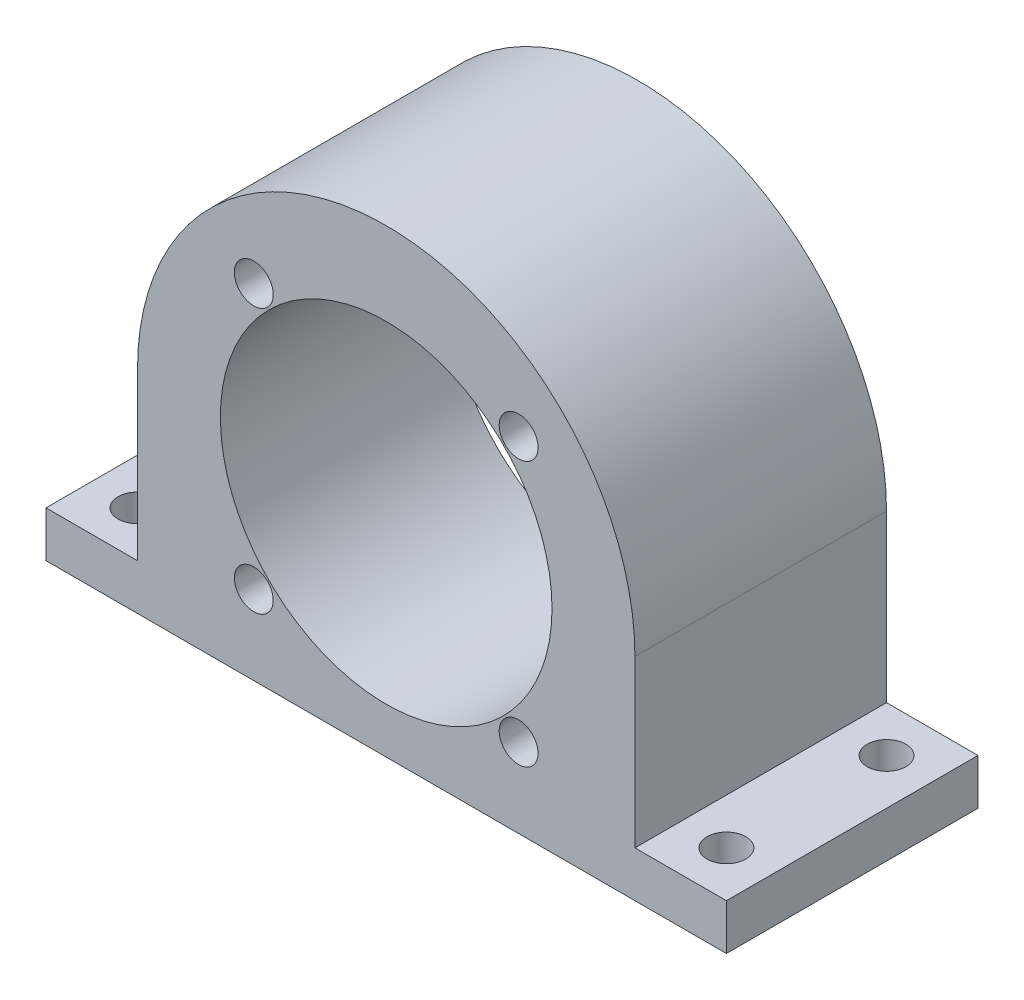
ISO-10303-21;
HEADER;
FILE_DESCRIPTION(('STEP AP214'),'2;1');
FILE_NAME('part.step','',(''),(''),'','','');
FILE_SCHEMA(('AUTOMOTIVE_DESIGN { 1 0 10303 214 1 1 1 1 }'));
ENDSEC;
DATA;
#1=APPLICATION_CONTEXT('core data for automotive mechanical design processes');
#2=APPLICATION_PROTOCOL_DEFINITION('international standard','automotive_design',2000,#1);
#3=PRODUCT_CONTEXT('',#1,'mechanical');
#4=PRODUCT('Part','Part','',(#3));
#5=PRODUCT_RELATED_PRODUCT_CATEGORY('part','',(#4));
#6=PRODUCT_DEFINITION_FORMATION('','',#4);
#7=PRODUCT_DEFINITION_CONTEXT('part definition',#1,'design');
#8=PRODUCT_DEFINITION('design','',#6,#7);
#9=PRODUCT_DEFINITION_SHAPE('','',#8);
#10=(LENGTH_UNIT() NAMED_UNIT(*) SI_UNIT(.MILLI.,.METRE.));
#11=(NAMED_UNIT(*) PLANE_ANGLE_UNIT() SI_UNIT($,.RADIAN.));
#12=(NAMED_UNIT(*) SI_UNIT($,.STERADIAN.) SOLID_ANGLE_UNIT());
#13=UNCERTAINTY_MEASURE_WITH_UNIT(LENGTH_MEASURE(1.E-05),#10,'distance_accuracy_value','');
#14=(GEOMETRIC_REPRESENTATION_CONTEXT(3) GLOBAL_UNCERTAINTY_ASSIGNED_CONTEXT((#13)) GLOBAL_UNIT_ASSIGNED_CONTEXT((#10,
#11,#12)) REPRESENTATION_CONTEXT('',''));
#15=CARTESIAN_POINT('',(0.,0.,0.));
#16=DIRECTION('',(0.,0.,1.));
#17=DIRECTION('',(1.,0.,0.));
#18=AXIS2_PLACEMENT_3D('',#15,#16,#17);
#19=CARTESIAN_POINT('',(21.75,18.5,11.));
#20=DIRECTION('',(-1.,0.,0.));
#21=DIRECTION('',(0.,0.,1.));
#22=AXIS2_PLACEMENT_3D('',#19,#20,#21);
#23=PLANE('',#22);
#24=DIRECTION('',(0.,0.,1.));
#25=VECTOR('',#24,1.);
#26=CARTESIAN_POINT('',(21.75,4.,11.));
#27=LINE('',#26,#25);
#28=CARTESIAN_POINT('',(21.75,4.,-11.));
#29=VERTEX_POINT('',#28);
#30=CARTESIAN_POINT('',(21.75,4.,11.));
#31=VERTEX_POINT('',#30);
#32=EDGE_CURVE('E345',#29,#31,#27,.T.);
#33=ORIENTED_EDGE('',*,*,#32,.F.);
#34=DIRECTION('',(0.,1.,0.));
#35=VECTOR('',#34,1.);
#36=CARTESIAN_POINT('',(21.75,18.5,-11.));
#37=LINE('',#36,#35);
#38=CARTESIAN_POINT('',(21.75,18.5,-11.));
#39=VERTEX_POINT('',#38);
#40=EDGE_CURVE('E412',#29,#39,#37,.T.);
#41=ORIENTED_EDGE('',*,*,#40,.T.);
#42=DIRECTION('',(0.,0.,-1.));
#43=VECTOR('',#42,1.);
#44=CARTESIAN_POINT('',(21.75,18.5,11.));
#45=LINE('',#44,#43);
#46=CARTESIAN_POINT('',(21.75,18.5,11.));
#47=VERTEX_POINT('',#46);
#48=EDGE_CURVE('E11',#47,#39,#45,.T.);
#49=ORIENTED_EDGE('',*,*,#48,.F.);
#50=DIRECTION('',(0.,1.,0.));
#51=VECTOR('',#50,1.);
#52=CARTESIAN_POINT('',(21.75,18.5,11.));
#53=LINE('',#52,#51);
#54=EDGE_CURVE('E403',#31,#47,#53,.T.);
#55=ORIENTED_EDGE('',*,*,#54,.F.);
#56=EDGE_LOOP('',(#33,#41,#49,#55));
#57=FACE_BOUND('',#56,.T.);
#58=ADVANCED_FACE('F35',(#57),#23,.F.);
#59=CARTESIAN_POINT('',(-21.75,18.5,11.));
#60=DIRECTION('',(1.,0.,0.));
#61=DIRECTION('',(0.,0.,-1.));
#62=AXIS2_PLACEMENT_3D('',#59,#60,#61);
#63=PLANE('',#62);
#64=DIRECTION('',(0.,0.,-1.));
#65=VECTOR('',#64,1.);
#66=CARTESIAN_POINT('',(-21.75,4.,-11.));
#67=LINE('',#66,#65);
#68=CARTESIAN_POINT('',(-21.75,4.,11.));
#69=VERTEX_POINT('',#68);
#70=CARTESIAN_POINT('',(-21.75,4.,-11.));
#71=VERTEX_POINT('',#70);
#72=EDGE_CURVE('E376',#69,#71,#67,.T.);
#73=ORIENTED_EDGE('',*,*,#72,.F.);
#74=DIRECTION('',(0.,-1.,0.));
#75=VECTOR('',#74,1.);
#76=CARTESIAN_POINT('',(-21.75,18.5,11.));
#77=LINE('',#76,#75);
#78=CARTESIAN_POINT('',(-21.75,18.5,11.));
#79=VERTEX_POINT('',#78);
#80=EDGE_CURVE('E397',#79,#69,#77,.T.);
#81=ORIENTED_EDGE('',*,*,#80,.F.);
#82=DIRECTION('',(0.,0.,-1.));
#83=VECTOR('',#82,1.);
#84=CARTESIAN_POINT('',(-21.75,18.5,11.));
#85=LINE('',#84,#83);
#86=CARTESIAN_POINT('',(-21.75,18.5,-11.));
#87=VERTEX_POINT('',#86);
#88=EDGE_CURVE('E43',#79,#87,#85,.T.);
#89=ORIENTED_EDGE('',*,*,#88,.T.);
#90=DIRECTION('',(0.,-1.,0.));
#91=VECTOR('',#90,1.);
#92=CARTESIAN_POINT('',(-21.75,18.5,-11.));
#93=LINE('',#92,#91);
#94=EDGE_CURVE('E392',#87,#71,#93,.T.);
#95=ORIENTED_EDGE('',*,*,#94,.T.);
#96=EDGE_LOOP('',(#73,#81,#89,#95));
#97=FACE_BOUND('',#96,.T.);
#98=ADVANCED_FACE('F37',(#97),#63,.F.);
#99=CARTESIAN_POINT('',(0.,18.5,11.));
#100=DIRECTION('',(0.,0.,1.));
#101=DIRECTION('',(1.,0.,0.));
#102=AXIS2_PLACEMENT_3D('',#99,#100,#101);
#103=PLANE('',#102);
#104=CARTESIAN_POINT('',(-11.5788735419298,30.0788735419296,11.));
#105=DIRECTION('',(0.,0.,1.));
#106=DIRECTION('',(0.,1.,0.));
#107=AXIS2_PLACEMENT_3D('',#104,#105,#106);
#108=CIRCLE('',#107,1.69999999999999);
#109=CARTESIAN_POINT('',(-11.5788735419299,31.7788735419296,11.));
#110=VERTEX_POINT('',#109);
#111=EDGE_CURVE('E261',#110,#110,#108,.F.);
#112=ORIENTED_EDGE('',*,*,#111,.T.);
#113=EDGE_LOOP('',(#112));
#114=FACE_BOUND('',#113,.T.);
#115=CARTESIAN_POINT('',(-11.5788735419297,6.92112645807019,11.));
#116=DIRECTION('',(0.,0.,1.));
#117=DIRECTION('',(-1.,0.,0.));
#118=AXIS2_PLACEMENT_3D('',#115,#116,#117);
#119=CIRCLE('',#118,1.69999999999999);
#120=CARTESIAN_POINT('',(-13.2788735419297,6.92112645807019,11.));
#121=VERTEX_POINT('',#120);
#122=EDGE_CURVE('E230',#121,#121,#119,.F.);
#123=ORIENTED_EDGE('',*,*,#122,.T.);
#124=EDGE_LOOP('',(#123));
#125=FACE_BOUND('',#124,.T.);
#126=CARTESIAN_POINT('',(11.5788735419299,6.92112645807044,11.));
#127=DIRECTION('',(0.,0.,1.));
#128=DIRECTION('',(0.,-1.,0.));
#129=AXIS2_PLACEMENT_3D('',#126,#127,#128);
#130=CIRCLE('',#129,1.69999999999999);
#131=CARTESIAN_POINT('',(11.5788735419299,5.22112645807044,11.));
#132=VERTEX_POINT('',#131);
#133=EDGE_CURVE('E262',#132,#132,#130,.F.);
#134=ORIENTED_EDGE('',*,*,#133,.T.);
#135=EDGE_LOOP('',(#134));
#136=FACE_BOUND('',#135,.T.);
#137=CARTESIAN_POINT('',(0.,18.5,11.));
#138=DIRECTION('',(0.,0.,1.));
#139=DIRECTION('',(1.,0.,0.));
#140=AXIS2_PLACEMENT_3D('',#137,#138,#139);
#141=CIRCLE('',#140,14.5);
#142=CARTESIAN_POINT('',(14.5,18.5,11.));
#143=VERTEX_POINT('',#142);
#144=EDGE_CURVE('E389',#143,#143,#141,.T.);
#145=ORIENTED_EDGE('',*,*,#144,.F.);
#146=EDGE_LOOP('',(#145));
#147=FACE_BOUND('',#146,.T.);
#148=ORIENTED_EDGE('',*,*,#80,.T.);
#149=DIRECTION('',(1.,0.,0.));
#150=VECTOR('',#149,1.);
#151=CARTESIAN_POINT('',(-29.75,4.,11.));
#152=LINE('',#151,#150);
#153=CARTESIAN_POINT('',(-29.75,4.,11.));
#154=VERTEX_POINT('',#153);
#155=EDGE_CURVE('E367',#154,#69,#152,.T.);
#156=ORIENTED_EDGE('',*,*,#155,.F.);
#157=DIRECTION('',(0.,-1.,0.));
#158=VECTOR('',#157,1.);
#159=CARTESIAN_POINT('',(-29.75,0.,11.));
#160=LINE('',#159,#158);
#161=CARTESIAN_POINT('',(-29.75,0.,11.));
#162=VERTEX_POINT('',#161);
#163=EDGE_CURVE('E364',#154,#162,#160,.T.);
#164=ORIENTED_EDGE('',*,*,#163,.T.);
#165=DIRECTION('',(1.,0.,0.));
#166=VECTOR('',#165,1.);
#167=CARTESIAN_POINT('',(-21.75,0.,11.));
#168=LINE('',#167,#166);
#169=CARTESIAN_POINT('',(29.75,0.,11.));
#170=VERTEX_POINT('',#169);
#171=EDGE_CURVE('E400',#162,#170,#168,.T.);
#172=ORIENTED_EDGE('',*,*,#171,.T.);
#173=DIRECTION('',(0.,-1.,0.));
#174=VECTOR('',#173,1.);
#175=CARTESIAN_POINT('',(29.75,0.,11.));
#176=LINE('',#175,#174);
#177=CARTESIAN_POINT('',(29.75,4.,11.));
#178=VERTEX_POINT('',#177);
#179=EDGE_CURVE('E346',#178,#170,#176,.T.);
#180=ORIENTED_EDGE('',*,*,#179,.F.);
#181=DIRECTION('',(-1.,0.,0.));
#182=VECTOR('',#181,1.);
#183=CARTESIAN_POINT('',(29.75,4.,11.));
#184=LINE('',#183,#182);
#185=EDGE_CURVE('E353',#178,#31,#184,.T.);
#186=ORIENTED_EDGE('',*,*,#185,.T.);
#187=ORIENTED_EDGE('',*,*,#54,.T.);
#188=CARTESIAN_POINT('',(0.,18.5,11.));
#189=DIRECTION('',(0.,0.,1.));
#190=DIRECTION('',(1.,0.,0.));
#191=AXIS2_PLACEMENT_3D('',#188,#189,#190);
#192=CIRCLE('',#191,21.75);
#193=EDGE_CURVE('E405',#47,#79,#192,.T.);
#194=ORIENTED_EDGE('',*,*,#193,.T.);
#195=EDGE_LOOP('',(#148,#156,#164,#172,#180,#186,#187,#194));
#196=FACE_BOUND('',#195,.T.);
#197=CARTESIAN_POINT('',(11.5788735419297,30.0788735419298,11.));
#198=DIRECTION('',(0.,0.,1.));
#199=DIRECTION('',(1.,0.,0.));
#200=AXIS2_PLACEMENT_3D('',#197,#198,#199);
#201=CIRCLE('',#200,1.69999999999999);
#202=CARTESIAN_POINT('',(13.2788735419297,30.0788735419298,11.));
#203=VERTEX_POINT('',#202);
#204=EDGE_CURVE('E296',#203,#203,#201,.F.);
#205=ORIENTED_EDGE('',*,*,#204,.T.);
#206=EDGE_LOOP('',(#205));
#207=FACE_BOUND('',#206,.T.);
#208=ADVANCED_FACE('F434',(#114,#125,#136,#147,#196,#207),#103,.T.);
#209=CARTESIAN_POINT('',(-29.75,4.,-11.));
#210=DIRECTION('',(0.,-1.,0.));
#211=DIRECTION('',(0.,0.,-1.));
#212=AXIS2_PLACEMENT_3D('',#209,#210,#211);
#213=PLANE('',#212);
#214=ORIENTED_EDGE('',*,*,#72,.T.);
#215=DIRECTION('',(1.,0.,0.));
#216=VECTOR('',#215,1.);
#217=CARTESIAN_POINT('',(-29.75,4.,-11.));
#218=LINE('',#217,#216);
#219=CARTESIAN_POINT('',(-29.75,4.,-11.));
#220=VERTEX_POINT('',#219);
#221=EDGE_CURVE('E384',#220,#71,#218,.T.);
#222=ORIENTED_EDGE('',*,*,#221,.F.);
#223=DIRECTION('',(0.,0.,-1.));
#224=VECTOR('',#223,1.);
#225=CARTESIAN_POINT('',(-29.75,4.,-11.));
#226=LINE('',#225,#224);
#227=EDGE_CURVE('E382',#154,#220,#226,.T.);
#228=ORIENTED_EDGE('',*,*,#227,.F.);
#229=ORIENTED_EDGE('',*,*,#155,.T.);
#230=EDGE_LOOP('',(#214,#222,#228,#229));
#231=FACE_BOUND('',#230,.T.);
#232=CARTESIAN_POINT('',(-25.75,4.,-7.));
#233=DIRECTION('',(0.,1.,0.));
#234=DIRECTION('',(0.,0.,1.));
#235=AXIS2_PLACEMENT_3D('',#232,#233,#234);
#236=CIRCLE('',#235,1.69999999999999);
#237=CARTESIAN_POINT('',(-25.75,4.,-5.30000000000001));
#238=VERTEX_POINT('',#237);
#239=EDGE_CURVE('E370',#238,#238,#236,.T.);
#240=ORIENTED_EDGE('',*,*,#239,.F.);
#241=EDGE_LOOP('',(#240));
#242=FACE_BOUND('',#241,.T.);
#243=CARTESIAN_POINT('',(-25.75,4.,7.));
#244=DIRECTION('',(0.,1.,0.));
#245=DIRECTION('',(0.,0.,1.));
#246=AXIS2_PLACEMENT_3D('',#243,#244,#245);
#247=CIRCLE('',#246,1.69999999999999);
#248=CARTESIAN_POINT('',(-25.75,4.,8.69999999999999));
#249=VERTEX_POINT('',#248);
#250=EDGE_CURVE('E358',#249,#249,#247,.T.);
#251=ORIENTED_EDGE('',*,*,#250,.F.);
#252=EDGE_LOOP('',(#251));
#253=FACE_BOUND('',#252,.T.);
#254=ADVANCED_FACE('F429',(#231,#242,#253),#213,.F.);
#255=CARTESIAN_POINT('',(0.,18.5,-11.));
#256=DIRECTION('',(0.,0.,1.));
#257=DIRECTION('',(1.,0.,0.));
#258=AXIS2_PLACEMENT_3D('',#255,#256,#257);
#259=PLANE('',#258);
#260=ORIENTED_EDGE('',*,*,#94,.F.);
#261=CARTESIAN_POINT('',(0.,18.5,-11.));
#262=DIRECTION('',(0.,0.,1.));
#263=DIRECTION('',(1.,0.,0.));
#264=AXIS2_PLACEMENT_3D('',#261,#262,#263);
#265=CIRCLE('',#264,21.75);
#266=EDGE_CURVE('E401',#39,#87,#265,.T.);
#267=ORIENTED_EDGE('',*,*,#266,.F.);
#268=ORIENTED_EDGE('',*,*,#40,.F.);
#269=DIRECTION('',(-1.,0.,0.));
#270=VECTOR('',#269,1.);
#271=CARTESIAN_POINT('',(29.75,4.,-11.));
#272=LINE('',#271,#270);
#273=CARTESIAN_POINT('',(29.75,4.,-11.));
#274=VERTEX_POINT('',#273);
#275=EDGE_CURVE('E336',#274,#29,#272,.T.);
#276=ORIENTED_EDGE('',*,*,#275,.F.);
#277=DIRECTION('',(0.,-1.,0.));
#278=VECTOR('',#277,1.);
#279=CARTESIAN_POINT('',(29.75,0.,-11.));
#280=LINE('',#279,#278);
#281=CARTESIAN_POINT('',(29.75,0.,-11.));
#282=VERTEX_POINT('',#281);
#283=EDGE_CURVE('E333',#274,#282,#280,.T.);
#284=ORIENTED_EDGE('',*,*,#283,.T.);
#285=DIRECTION('',(1.,0.,0.));
#286=VECTOR('',#285,1.);
#287=CARTESIAN_POINT('',(-21.75,0.,-11.));
#288=LINE('',#287,#286);
#289=CARTESIAN_POINT('',(-29.75,0.,-11.));
#290=VERTEX_POINT('',#289);
#291=EDGE_CURVE('E409',#290,#282,#288,.T.);
#292=ORIENTED_EDGE('',*,*,#291,.F.);
#293=DIRECTION('',(0.,-1.,0.));
#294=VECTOR('',#293,1.);
#295=CARTESIAN_POINT('',(-29.75,0.,-11.));
#296=LINE('',#295,#294);
#297=EDGE_CURVE('E377',#220,#290,#296,.T.);
#298=ORIENTED_EDGE('',*,*,#297,.F.);
#299=ORIENTED_EDGE('',*,*,#221,.T.);
#300=EDGE_LOOP('',(#260,#267,#268,#276,#284,#292,#298,#299));
#301=FACE_BOUND('',#300,.T.);
#302=CARTESIAN_POINT('',(-11.5788735419298,30.0788735419296,-11.));
#303=DIRECTION('',(0.,0.,-1.));
#304=DIRECTION('',(0.,1.,0.));
#305=AXIS2_PLACEMENT_3D('',#302,#303,#304);
#306=CIRCLE('',#305,3.87499999999999);
#307=CARTESIAN_POINT('',(-14.3189123190277,27.3388347648318,-11.));
#308=VERTEX_POINT('',#307);
#309=CARTESIAN_POINT('',(-8.838834764832,32.8189123190275,-11.));
#310=VERTEX_POINT('',#309);
#311=EDGE_CURVE('E214',#308,#310,#306,.T.);
#312=ORIENTED_EDGE('',*,*,#311,.F.);
#313=DIRECTION('',(-0.707106781186552,0.707106781186543,0.));
#314=VECTOR('',#313,1.);
#315=CARTESIAN_POINT('',(-14.3189123190277,27.3388347648318,-11.));
#316=LINE('',#315,#314);
#317=CARTESIAN_POINT('',(-12.6201798439046,25.6401022897087,-11.));
#318=VERTEX_POINT('',#317);
#319=EDGE_CURVE('E224',#318,#308,#316,.T.);
#320=ORIENTED_EDGE('',*,*,#319,.F.);
#321=CARTESIAN_POINT('',(0.,18.5,-11.));
#322=DIRECTION('',(0.,0.,1.));
#323=DIRECTION('',(1.,0.,0.));
#324=AXIS2_PLACEMENT_3D('',#321,#322,#323);
#325=CIRCLE('',#324,14.5);
#326=CARTESIAN_POINT('',(-12.6201798439045,11.3598977102911,-11.));
#327=VERTEX_POINT('',#326);
#328=EDGE_CURVE('E396',#318,#327,#325,.T.);
#329=ORIENTED_EDGE('',*,*,#328,.T.);
#330=DIRECTION('',(0.707106781186543,0.707106781186552,0.));
#331=VECTOR('',#330,1.);
#332=CARTESIAN_POINT('',(-14.3189123190276,9.66116523516805,-11.));
#333=LINE('',#332,#331);
#334=CARTESIAN_POINT('',(-14.3189123190276,9.66116523516805,-11.));
#335=VERTEX_POINT('',#334);
#336=EDGE_CURVE('E246',#335,#327,#333,.T.);
#337=ORIENTED_EDGE('',*,*,#336,.F.);
#338=CARTESIAN_POINT('',(-11.5788735419297,6.92112645807019,-11.));
#339=DIRECTION('',(0.,0.,-1.));
#340=DIRECTION('',(-1.,0.,0.));
#341=AXIS2_PLACEMENT_3D('',#338,#339,#340);
#342=CIRCLE('',#341,3.87499999999999);
#343=CARTESIAN_POINT('',(-8.8388347648318,4.18108768097234,-11.));
#344=VERTEX_POINT('',#343);
#345=EDGE_CURVE('E251',#344,#335,#342,.T.);
#346=ORIENTED_EDGE('',*,*,#345,.F.);
#347=DIRECTION('',(-0.707106781186546,-0.70710678118655,0.));
#348=VECTOR('',#347,1.);
#349=CARTESIAN_POINT('',(-8.8388347648318,4.18108768097234,-11.));
#350=LINE('',#349,#348);
#351=CARTESIAN_POINT('',(-7.14010228970875,5.8798201560954,-11.));
#352=VERTEX_POINT('',#351);
#353=EDGE_CURVE('E256',#352,#344,#350,.T.);
#354=ORIENTED_EDGE('',*,*,#353,.F.);
#355=CARTESIAN_POINT('',(7.14010228970902,5.87982015609555,-11.));
#356=VERTEX_POINT('',#355);
#357=EDGE_CURVE('E609',#352,#356,#325,.T.);
#358=ORIENTED_EDGE('',*,*,#357,.T.);
#359=DIRECTION('',(-0.707106781186559,0.707106781186536,0.));
#360=VECTOR('',#359,1.);
#361=CARTESIAN_POINT('',(8.8388347648321,4.18108768097252,-11.));
#362=LINE('',#361,#360);
#363=CARTESIAN_POINT('',(8.8388347648321,4.18108768097252,-11.));
#364=VERTEX_POINT('',#363);
#365=EDGE_CURVE('E278',#364,#356,#362,.T.);
#366=ORIENTED_EDGE('',*,*,#365,.F.);
#367=CARTESIAN_POINT('',(11.5788735419299,6.92112645807044,-11.));
#368=DIRECTION('',(0.,0.,-1.));
#369=DIRECTION('',(0.,-1.,0.));
#370=AXIS2_PLACEMENT_3D('',#367,#368,#369);
#371=CIRCLE('',#370,3.87499999999999);
#372=CARTESIAN_POINT('',(14.3189123190277,9.66116523516835,-11.));
#373=VERTEX_POINT('',#372);
#374=EDGE_CURVE('E285',#373,#364,#371,.T.);
#375=ORIENTED_EDGE('',*,*,#374,.F.);
#376=DIRECTION('',(0.707106781186557,-0.707106781186538,0.));
#377=VECTOR('',#376,1.);
#378=CARTESIAN_POINT('',(14.3189123190277,9.66116523516835,-11.));
#379=LINE('',#378,#377);
#380=CARTESIAN_POINT('',(12.6201798439047,11.3598977102914,-11.));
#381=VERTEX_POINT('',#380);
#382=EDGE_CURVE('E290',#381,#373,#379,.T.);
#383=ORIENTED_EDGE('',*,*,#382,.F.);
#384=CARTESIAN_POINT('',(12.6201798439045,25.6401022897089,-11.));
#385=VERTEX_POINT('',#384);
#386=EDGE_CURVE('E388',#381,#385,#325,.T.);
#387=ORIENTED_EDGE('',*,*,#386,.T.);
#388=DIRECTION('',(-0.707106781186543,-0.707106781186552,0.));
#389=VECTOR('',#388,1.);
#390=CARTESIAN_POINT('',(14.3189123190276,27.338834764832,-11.));
#391=LINE('',#390,#389);
#392=CARTESIAN_POINT('',(14.3189123190276,27.338834764832,-11.));
#393=VERTEX_POINT('',#392);
#394=EDGE_CURVE('E314',#393,#385,#391,.T.);
#395=ORIENTED_EDGE('',*,*,#394,.F.);
#396=CARTESIAN_POINT('',(11.5788735419297,30.0788735419298,-11.));
#397=DIRECTION('',(0.,0.,-1.));
#398=DIRECTION('',(1.,0.,0.));
#399=AXIS2_PLACEMENT_3D('',#396,#397,#398);
#400=CIRCLE('',#399,3.87499999999999);
#401=CARTESIAN_POINT('',(8.8388347648318,32.8189123190277,-11.));
#402=VERTEX_POINT('',#401);
#403=EDGE_CURVE('E299',#402,#393,#400,.T.);
#404=ORIENTED_EDGE('',*,*,#403,.F.);
#405=DIRECTION('',(0.707106781186546,0.70710678118655,0.));
#406=VECTOR('',#405,1.);
#407=CARTESIAN_POINT('',(8.8388347648318,32.8189123190277,-11.));
#408=LINE('',#407,#406);
#409=CARTESIAN_POINT('',(7.14010228970875,31.1201798439046,-11.));
#410=VERTEX_POINT('',#409);
#411=EDGE_CURVE('E304',#410,#402,#408,.T.);
#412=ORIENTED_EDGE('',*,*,#411,.F.);
#413=CARTESIAN_POINT('',(-7.14010228970893,31.1201798439045,-11.));
#414=VERTEX_POINT('',#413);
#415=EDGE_CURVE('E393',#410,#414,#325,.T.);
#416=ORIENTED_EDGE('',*,*,#415,.T.);
#417=DIRECTION('',(0.707106781186554,-0.707106781186541,0.));
#418=VECTOR('',#417,1.);
#419=CARTESIAN_POINT('',(-8.838834764832,32.8189123190275,-11.));
#420=LINE('',#419,#418);
#421=EDGE_CURVE('E219',#310,#414,#420,.T.);
#422=ORIENTED_EDGE('',*,*,#421,.F.);
#423=EDGE_LOOP('',(#312,#320,#329,#337,#346,#354,#358,#366,#375,#383,#387,#395,#404,#412,#416,#422));
#424=FACE_BOUND('',#423,.T.);
#425=ADVANCED_FACE('F423',(#301,#424),#259,.F.);
#426=CARTESIAN_POINT('',(-21.75,0.,11.));
#427=DIRECTION('',(0.,1.,0.));
#428=DIRECTION('',(0.,0.,1.));
#429=AXIS2_PLACEMENT_3D('',#426,#427,#428);
#430=PLANE('',#429);
#431=CARTESIAN_POINT('',(-25.75,0.,7.));
#432=DIRECTION('',(0.,1.,0.));
#433=DIRECTION('',(0.,0.,1.));
#434=AXIS2_PLACEMENT_3D('',#431,#432,#433);
#435=CIRCLE('',#434,1.69999999999999);
#436=CARTESIAN_POINT('',(-25.75,0.,8.69999999999999));
#437=VERTEX_POINT('',#436);
#438=EDGE_CURVE('E361',#437,#437,#435,.T.);
#439=ORIENTED_EDGE('',*,*,#438,.T.);
#440=EDGE_LOOP('',(#439));
#441=FACE_BOUND('',#440,.T.);
#442=CARTESIAN_POINT('',(25.75,0.,7.));
#443=DIRECTION('',(0.,1.,0.));
#444=DIRECTION('',(0.,0.,1.));
#445=AXIS2_PLACEMENT_3D('',#442,#443,#444);
#446=CIRCLE('',#445,1.69999999999999);
#447=CARTESIAN_POINT('',(25.75,0.,8.69999999999999));
#448=VERTEX_POINT('',#447);
#449=EDGE_CURVE('E342',#448,#448,#446,.T.);
#450=ORIENTED_EDGE('',*,*,#449,.T.);
#451=EDGE_LOOP('',(#450));
#452=FACE_BOUND('',#451,.T.);
#453=ORIENTED_EDGE('',*,*,#171,.F.);
#454=DIRECTION('',(0.,0.,1.));
#455=VECTOR('',#454,1.);
#456=CARTESIAN_POINT('',(-29.75,0.,-11.));
#457=LINE('',#456,#455);
#458=EDGE_CURVE('E380',#290,#162,#457,.T.);
#459=ORIENTED_EDGE('',*,*,#458,.F.);
#460=ORIENTED_EDGE('',*,*,#291,.T.);
#461=DIRECTION('',(0.,0.,-1.));
#462=VECTOR('',#461,1.);
#463=CARTESIAN_POINT('',(29.75,0.,11.));
#464=LINE('',#463,#462);
#465=EDGE_CURVE('E349',#170,#282,#464,.T.);
#466=ORIENTED_EDGE('',*,*,#465,.F.);
#467=EDGE_LOOP('',(#453,#459,#460,#466));
#468=FACE_BOUND('',#467,.T.);
#469=CARTESIAN_POINT('',(-25.75,0.,-7.));
#470=DIRECTION('',(0.,1.,0.));
#471=DIRECTION('',(0.,0.,1.));
#472=AXIS2_PLACEMENT_3D('',#469,#470,#471);
#473=CIRCLE('',#472,1.69999999999999);
#474=CARTESIAN_POINT('',(-25.75,0.,-5.30000000000001));
#475=VERTEX_POINT('',#474);
#476=EDGE_CURVE('E373',#475,#475,#473,.T.);
#477=ORIENTED_EDGE('',*,*,#476,.T.);
#478=EDGE_LOOP('',(#477));
#479=FACE_BOUND('',#478,.T.);
#480=CARTESIAN_POINT('',(25.75,0.,-7.));
#481=DIRECTION('',(0.,1.,0.));
#482=DIRECTION('',(0.,0.,1.));
#483=AXIS2_PLACEMENT_3D('',#480,#481,#482);
#484=CIRCLE('',#483,1.69999999999999);
#485=CARTESIAN_POINT('',(25.75,0.,-5.30000000000001));
#486=VERTEX_POINT('',#485);
#487=EDGE_CURVE('E330',#486,#486,#484,.T.);
#488=ORIENTED_EDGE('',*,*,#487,.T.);
#489=EDGE_LOOP('',(#488));
#490=FACE_BOUND('',#489,.T.);
#491=ADVANCED_FACE('F452',(#441,#452,#468,#479,#490),#430,.F.);
#492=CARTESIAN_POINT('',(0.,18.5,11.));
#493=DIRECTION('',(0.,0.,-1.));
#494=DIRECTION('',(-1.,0.,0.));
#495=AXIS2_PLACEMENT_3D('',#492,#493,#494);
#496=CYLINDRICAL_SURFACE('',#495,21.75);
#497=ORIENTED_EDGE('',*,*,#266,.T.);
#498=ORIENTED_EDGE('',*,*,#88,.F.);
#499=ORIENTED_EDGE('',*,*,#193,.F.);
#500=ORIENTED_EDGE('',*,*,#48,.T.);
#501=EDGE_LOOP('',(#497,#498,#499,#500));
#502=FACE_BOUND('',#501,.T.);
#503=ADVANCED_FACE('F437',(#502),#496,.T.);
#504=CARTESIAN_POINT('',(0.,18.5,11.));
#505=DIRECTION('',(0.,0.,-1.));
#506=DIRECTION('',(-1.,0.,0.));
#507=AXIS2_PLACEMENT_3D('',#504,#505,#506);
#508=CYLINDRICAL_SURFACE('',#507,14.5);
#509=DIRECTION('',(0.,0.,-1.));
#510=VECTOR('',#509,1.);
#511=CARTESIAN_POINT('',(-12.6201798439046,25.6401022897087,-9.));
#512=LINE('',#511,#510);
#513=CARTESIAN_POINT('',(-12.6201798439046,25.6401022897087,-9.));
#514=VERTEX_POINT('',#513);
#515=EDGE_CURVE('E227',#514,#318,#512,.T.);
#516=ORIENTED_EDGE('',*,*,#515,.F.);
#517=CARTESIAN_POINT('',(0.,18.5,-9.));
#518=DIRECTION('',(0.,0.,1.));
#519=DIRECTION('',(0.,-1.,0.));
#520=AXIS2_PLACEMENT_3D('',#517,#518,#519);
#521=CIRCLE('',#520,14.5);
#522=CARTESIAN_POINT('',(-7.14010228970893,31.1201798439045,-9.));
#523=VERTEX_POINT('',#522);
#524=EDGE_CURVE('E587',#523,#514,#521,.T.);
#525=ORIENTED_EDGE('',*,*,#524,.F.);
#526=DIRECTION('',(0.,0.,-1.));
#527=VECTOR('',#526,1.);
#528=CARTESIAN_POINT('',(-7.14010228970893,31.1201798439045,-9.));
#529=LINE('',#528,#527);
#530=EDGE_CURVE('E50',#523,#414,#529,.T.);
#531=ORIENTED_EDGE('',*,*,#530,.T.);
#532=ORIENTED_EDGE('',*,*,#415,.F.);
#533=DIRECTION('',(0.,0.,-1.));
#534=VECTOR('',#533,1.);
#535=CARTESIAN_POINT('',(7.14010228970875,31.1201798439046,-9.));
#536=LINE('',#535,#534);
#537=CARTESIAN_POINT('',(7.14010228970875,31.1201798439046,-9.));
#538=VERTEX_POINT('',#537);
#539=EDGE_CURVE('E322',#538,#410,#536,.T.);
#540=ORIENTED_EDGE('',*,*,#539,.F.);
#541=CARTESIAN_POINT('',(0.,18.5,-9.));
#542=DIRECTION('',(0.,0.,1.));
#543=DIRECTION('',(-1.,0.,0.));
#544=AXIS2_PLACEMENT_3D('',#541,#542,#543);
#545=CIRCLE('',#544,14.5);
#546=CARTESIAN_POINT('',(12.6201798439045,25.6401022897089,-9.));
#547=VERTEX_POINT('',#546);
#548=EDGE_CURVE('E306',#547,#538,#545,.T.);
#549=ORIENTED_EDGE('',*,*,#548,.F.);
#550=DIRECTION('',(0.,0.,-1.));
#551=VECTOR('',#550,1.);
#552=CARTESIAN_POINT('',(12.6201798439045,25.6401022897089,-9.));
#553=LINE('',#552,#551);
#554=EDGE_CURVE('E324',#547,#385,#553,.T.);
#555=ORIENTED_EDGE('',*,*,#554,.T.);
#556=ORIENTED_EDGE('',*,*,#386,.F.);
#557=DIRECTION('',(0.,0.,-1.));
#558=VECTOR('',#557,1.);
#559=CARTESIAN_POINT('',(12.6201798439047,11.3598977102914,-9.));
#560=LINE('',#559,#558);
#561=CARTESIAN_POINT('',(12.6201798439047,11.3598977102914,-9.));
#562=VERTEX_POINT('',#561);
#563=EDGE_CURVE('E234',#562,#381,#560,.T.);
#564=ORIENTED_EDGE('',*,*,#563,.F.);
#565=CARTESIAN_POINT('',(0.,18.5,-9.));
#566=DIRECTION('',(0.,0.,1.));
#567=DIRECTION('',(0.,1.,0.));
#568=AXIS2_PLACEMENT_3D('',#565,#566,#567);
#569=CIRCLE('',#568,14.5);
#570=CARTESIAN_POINT('',(7.14010228970902,5.87982015609555,-9.));
#571=VERTEX_POINT('',#570);
#572=EDGE_CURVE('E265',#571,#562,#569,.T.);
#573=ORIENTED_EDGE('',*,*,#572,.F.);
#574=DIRECTION('',(0.,0.,-1.));
#575=VECTOR('',#574,1.);
#576=CARTESIAN_POINT('',(7.14010228970902,5.87982015609555,-9.));
#577=LINE('',#576,#575);
#578=EDGE_CURVE('E280',#571,#356,#577,.T.);
#579=ORIENTED_EDGE('',*,*,#578,.T.);
#580=ORIENTED_EDGE('',*,*,#357,.F.);
#581=DIRECTION('',(0.,0.,-1.));
#582=VECTOR('',#581,1.);
#583=CARTESIAN_POINT('',(-7.14010228970875,5.8798201560954,-9.));
#584=LINE('',#583,#582);
#585=CARTESIAN_POINT('',(-7.14010228970875,5.8798201560954,-9.));
#586=VERTEX_POINT('',#585);
#587=EDGE_CURVE('E259',#586,#352,#584,.T.);
#588=ORIENTED_EDGE('',*,*,#587,.F.);
#589=CARTESIAN_POINT('',(0.,18.5,-9.));
#590=DIRECTION('',(0.,0.,1.));
#591=DIRECTION('',(1.,0.,0.));
#592=AXIS2_PLACEMENT_3D('',#589,#590,#591);
#593=CIRCLE('',#592,14.5);
#594=CARTESIAN_POINT('',(-12.6201798439045,11.3598977102911,-9.));
#595=VERTEX_POINT('',#594);
#596=EDGE_CURVE('E233',#595,#586,#593,.T.);
#597=ORIENTED_EDGE('',*,*,#596,.F.);
#598=DIRECTION('',(0.,0.,-1.));
#599=VECTOR('',#598,1.);
#600=CARTESIAN_POINT('',(-12.6201798439045,11.3598977102911,-9.));
#601=LINE('',#600,#599);
#602=EDGE_CURVE('E58',#595,#327,#601,.T.);
#603=ORIENTED_EDGE('',*,*,#602,.T.);
#604=ORIENTED_EDGE('',*,*,#328,.F.);
#605=EDGE_LOOP('',(#516,#525,#531,#532,#540,#549,#555,#556,#564,#573,#579,#580,#588,#597,#603,#604));
#606=FACE_BOUND('',#605,.T.);
#607=ORIENTED_EDGE('',*,*,#144,.T.);
#608=EDGE_LOOP('',(#607));
#609=FACE_BOUND('',#608,.T.);
#610=ADVANCED_FACE('F458',(#606,#609),#508,.F.);
#611=CARTESIAN_POINT('',(-29.75,0.,0.));
#612=DIRECTION('',(1.,0.,0.));
#613=DIRECTION('',(0.,0.,-1.));
#614=AXIS2_PLACEMENT_3D('',#611,#612,#613);
#615=PLANE('',#614);
#616=ORIENTED_EDGE('',*,*,#297,.T.);
#617=ORIENTED_EDGE('',*,*,#458,.T.);
#618=ORIENTED_EDGE('',*,*,#163,.F.);
#619=ORIENTED_EDGE('',*,*,#227,.T.);
#620=EDGE_LOOP('',(#616,#617,#618,#619));
#621=FACE_BOUND('',#620,.T.);
#622=ADVANCED_FACE('F455',(#621),#615,.F.);
#623=CARTESIAN_POINT('',(-25.75,4.,-7.));
#624=DIRECTION('',(0.,1.,0.));
#625=DIRECTION('',(0.,0.,1.));
#626=AXIS2_PLACEMENT_3D('',#623,#624,#625);
#627=CYLINDRICAL_SURFACE('',#626,1.69999999999999);
#628=ORIENTED_EDGE('',*,*,#476,.F.);
#629=EDGE_LOOP('',(#628));
#630=FACE_BOUND('',#629,.T.);
#631=ORIENTED_EDGE('',*,*,#239,.T.);
#632=EDGE_LOOP('',(#631));
#633=FACE_BOUND('',#632,.T.);
#634=ADVANCED_FACE('F457',(#630,#633),#627,.F.);
#635=CARTESIAN_POINT('',(-25.75,4.,7.));
#636=DIRECTION('',(0.,1.,0.));
#637=DIRECTION('',(0.,0.,1.));
#638=AXIS2_PLACEMENT_3D('',#635,#636,#637);
#639=CYLINDRICAL_SURFACE('',#638,1.69999999999999);
#640=ORIENTED_EDGE('',*,*,#438,.F.);
#641=EDGE_LOOP('',(#640));
#642=FACE_BOUND('',#641,.T.);
#643=ORIENTED_EDGE('',*,*,#250,.T.);
#644=EDGE_LOOP('',(#643));
#645=FACE_BOUND('',#644,.T.);
#646=ADVANCED_FACE('F464',(#642,#645),#639,.F.);
#647=CARTESIAN_POINT('',(29.75,4.,11.));
#648=DIRECTION('',(0.,-1.,0.));
#649=DIRECTION('',(0.,0.,-1.));
#650=AXIS2_PLACEMENT_3D('',#647,#648,#649);
#651=PLANE('',#650);
#652=CARTESIAN_POINT('',(25.75,4.,7.));
#653=DIRECTION('',(0.,1.,0.));
#654=DIRECTION('',(0.,0.,1.));
#655=AXIS2_PLACEMENT_3D('',#652,#653,#654);
#656=CIRCLE('',#655,1.69999999999999);
#657=CARTESIAN_POINT('',(25.75,4.,8.69999999999999));
#658=VERTEX_POINT('',#657);
#659=EDGE_CURVE('E339',#658,#658,#656,.T.);
#660=ORIENTED_EDGE('',*,*,#659,.F.);
#661=EDGE_LOOP('',(#660));
#662=FACE_BOUND('',#661,.T.);
#663=ORIENTED_EDGE('',*,*,#32,.T.);
#664=ORIENTED_EDGE('',*,*,#185,.F.);
#665=DIRECTION('',(0.,0.,1.));
#666=VECTOR('',#665,1.);
#667=CARTESIAN_POINT('',(29.75,4.,11.));
#668=LINE('',#667,#666);
#669=EDGE_CURVE('E351',#274,#178,#668,.T.);
#670=ORIENTED_EDGE('',*,*,#669,.F.);
#671=ORIENTED_EDGE('',*,*,#275,.T.);
#672=EDGE_LOOP('',(#663,#664,#670,#671));
#673=FACE_BOUND('',#672,.T.);
#674=CARTESIAN_POINT('',(25.75,4.,-7.));
#675=DIRECTION('',(0.,1.,0.));
#676=DIRECTION('',(0.,0.,1.));
#677=AXIS2_PLACEMENT_3D('',#674,#675,#676);
#678=CIRCLE('',#677,1.69999999999999);
#679=CARTESIAN_POINT('',(25.75,4.,-5.30000000000001));
#680=VERTEX_POINT('',#679);
#681=EDGE_CURVE('E321',#680,#680,#678,.T.);
#682=ORIENTED_EDGE('',*,*,#681,.F.);
#683=EDGE_LOOP('',(#682));
#684=FACE_BOUND('',#683,.T.);
#685=ADVANCED_FACE('F442',(#662,#673,#684),#651,.F.);
#686=CARTESIAN_POINT('',(29.75,0.,0.));
#687=DIRECTION('',(-1.,0.,0.));
#688=DIRECTION('',(0.,0.,1.));
#689=AXIS2_PLACEMENT_3D('',#686,#687,#688);
#690=PLANE('',#689);
#691=ORIENTED_EDGE('',*,*,#179,.T.);
#692=ORIENTED_EDGE('',*,*,#465,.T.);
#693=ORIENTED_EDGE('',*,*,#283,.F.);
#694=ORIENTED_EDGE('',*,*,#669,.T.);
#695=EDGE_LOOP('',(#691,#692,#693,#694));
#696=FACE_BOUND('',#695,.T.);
#697=ADVANCED_FACE('F447',(#696),#690,.F.);
#698=CARTESIAN_POINT('',(25.75,4.,7.));
#699=DIRECTION('',(0.,1.,0.));
#700=DIRECTION('',(0.,0.,1.));
#701=AXIS2_PLACEMENT_3D('',#698,#699,#700);
#702=CYLINDRICAL_SURFACE('',#701,1.69999999999999);
#703=ORIENTED_EDGE('',*,*,#449,.F.);
#704=EDGE_LOOP('',(#703));
#705=FACE_BOUND('',#704,.T.);
#706=ORIENTED_EDGE('',*,*,#659,.T.);
#707=EDGE_LOOP('',(#706));
#708=FACE_BOUND('',#707,.T.);
#709=ADVANCED_FACE('F487',(#705,#708),#702,.F.);
#710=CARTESIAN_POINT('',(25.75,4.,-7.));
#711=DIRECTION('',(0.,1.,0.));
#712=DIRECTION('',(0.,0.,1.));
#713=AXIS2_PLACEMENT_3D('',#710,#711,#712);
#714=CYLINDRICAL_SURFACE('',#713,1.69999999999999);
#715=ORIENTED_EDGE('',*,*,#487,.F.);
#716=EDGE_LOOP('',(#715));
#717=FACE_BOUND('',#716,.T.);
#718=ORIENTED_EDGE('',*,*,#681,.T.);
#719=EDGE_LOOP('',(#718));
#720=FACE_BOUND('',#719,.T.);
#721=ADVANCED_FACE('F490',(#717,#720),#714,.F.);
#722=CARTESIAN_POINT('',(11.5788735419297,30.0788735419298,-9.));
#723=DIRECTION('',(0.,0.,-1.));
#724=DIRECTION('',(-1.,0.,0.));
#725=AXIS2_PLACEMENT_3D('',#722,#723,#724);
#726=CYLINDRICAL_SURFACE('',#725,3.87499999999999);
#727=ORIENTED_EDGE('',*,*,#403,.T.);
#728=DIRECTION('',(0.,0.,-1.));
#729=VECTOR('',#728,1.);
#730=CARTESIAN_POINT('',(14.3189123190276,27.338834764832,-9.));
#731=LINE('',#730,#729);
#732=CARTESIAN_POINT('',(14.3189123190276,27.338834764832,-9.));
#733=VERTEX_POINT('',#732);
#734=EDGE_CURVE('E311',#733,#393,#731,.T.);
#735=ORIENTED_EDGE('',*,*,#734,.F.);
#736=CARTESIAN_POINT('',(11.5788735419297,30.0788735419298,-9.));
#737=DIRECTION('',(0.,0.,-1.));
#738=DIRECTION('',(1.,0.,0.));
#739=AXIS2_PLACEMENT_3D('',#736,#737,#738);
#740=CIRCLE('',#739,3.87499999999999);
#741=CARTESIAN_POINT('',(8.8388347648318,32.8189123190277,-9.));
#742=VERTEX_POINT('',#741);
#743=EDGE_CURVE('E300',#742,#733,#740,.T.);
#744=ORIENTED_EDGE('',*,*,#743,.F.);
#745=DIRECTION('',(0.,0.,-1.));
#746=VECTOR('',#745,1.);
#747=CARTESIAN_POINT('',(8.8388347648318,32.8189123190277,-9.));
#748=LINE('',#747,#746);
#749=EDGE_CURVE('E319',#742,#402,#748,.T.);
#750=ORIENTED_EDGE('',*,*,#749,.T.);
#751=EDGE_LOOP('',(#727,#735,#744,#750));
#752=FACE_BOUND('',#751,.T.);
#753=ADVANCED_FACE('F506',(#752),#726,.F.);
#754=CARTESIAN_POINT('',(8.8388347648318,32.8189123190277,-9.));
#755=DIRECTION('',(-0.70710678118655,0.707106781186546,0.));
#756=DIRECTION('',(-0.707106781186546,-0.70710678118655,0.));
#757=AXIS2_PLACEMENT_3D('',#754,#755,#756);
#758=PLANE('',#757);
#759=ORIENTED_EDGE('',*,*,#411,.T.);
#760=ORIENTED_EDGE('',*,*,#749,.F.);
#761=DIRECTION('',(0.707106781186546,0.70710678118655,0.));
#762=VECTOR('',#761,1.);
#763=CARTESIAN_POINT('',(8.8388347648318,32.8189123190277,-9.));
#764=LINE('',#763,#762);
#765=EDGE_CURVE('E308',#538,#742,#764,.T.);
#766=ORIENTED_EDGE('',*,*,#765,.F.);
#767=ORIENTED_EDGE('',*,*,#539,.T.);
#768=EDGE_LOOP('',(#759,#760,#766,#767));
#769=FACE_BOUND('',#768,.T.);
#770=ADVANCED_FACE('F510',(#769),#758,.F.);
#771=CARTESIAN_POINT('',(14.3189123190276,27.338834764832,-9.));
#772=DIRECTION('',(0.707106781186552,-0.707106781186543,0.));
#773=DIRECTION('',(0.707106781186543,0.707106781186552,0.));
#774=AXIS2_PLACEMENT_3D('',#771,#772,#773);
#775=PLANE('',#774);
#776=ORIENTED_EDGE('',*,*,#394,.T.);
#777=ORIENTED_EDGE('',*,*,#554,.F.);
#778=DIRECTION('',(-0.707106781186543,-0.707106781186552,0.));
#779=VECTOR('',#778,1.);
#780=CARTESIAN_POINT('',(14.3189123190276,27.338834764832,-9.));
#781=LINE('',#780,#779);
#782=EDGE_CURVE('E303',#733,#547,#781,.T.);
#783=ORIENTED_EDGE('',*,*,#782,.F.);
#784=ORIENTED_EDGE('',*,*,#734,.T.);
#785=EDGE_LOOP('',(#776,#777,#783,#784));
#786=FACE_BOUND('',#785,.T.);
#787=ADVANCED_FACE('F512',(#786),#775,.F.);
#788=CARTESIAN_POINT('',(11.5788735419297,30.0788735419298,-9.));
#789=DIRECTION('',(0.,0.,1.));
#790=DIRECTION('',(1.,0.,0.));
#791=AXIS2_PLACEMENT_3D('',#788,#789,#790);
#792=PLANE('',#791);
#793=CARTESIAN_POINT('',(11.5788735419297,30.0788735419298,-9.));
#794=DIRECTION('',(0.,0.,-1.));
#795=DIRECTION('',(-1.,0.,0.));
#796=AXIS2_PLACEMENT_3D('',#793,#794,#795);
#797=CIRCLE('',#796,1.69999999999999);
#798=CARTESIAN_POINT('',(9.87887354192969,30.0788735419298,-9.));
#799=VERTEX_POINT('',#798);
#800=EDGE_CURVE('E229',#799,#799,#797,.T.);
#801=ORIENTED_EDGE('',*,*,#800,.F.);
#802=EDGE_LOOP('',(#801));
#803=FACE_BOUND('',#802,.T.);
#804=ORIENTED_EDGE('',*,*,#743,.T.);
#805=ORIENTED_EDGE('',*,*,#782,.T.);
#806=ORIENTED_EDGE('',*,*,#548,.T.);
#807=ORIENTED_EDGE('',*,*,#765,.T.);
#808=EDGE_LOOP('',(#804,#805,#806,#807));
#809=FACE_BOUND('',#808,.T.);
#810=ADVANCED_FACE('F515',(#803,#809),#792,.F.);
#811=CARTESIAN_POINT('',(11.5788735419297,30.0788735419298,-9.));
#812=DIRECTION('',(0.,0.,-1.));
#813=DIRECTION('',(-1.,0.,0.));
#814=AXIS2_PLACEMENT_3D('',#811,#812,#813);
#815=CYLINDRICAL_SURFACE('',#814,1.69999999999999);
#816=ORIENTED_EDGE('',*,*,#204,.F.);
#817=EDGE_LOOP('',(#816));
#818=FACE_BOUND('',#817,.T.);
#819=ORIENTED_EDGE('',*,*,#800,.T.);
#820=EDGE_LOOP('',(#819));
#821=FACE_BOUND('',#820,.T.);
#822=ADVANCED_FACE('F522',(#818,#821),#815,.F.);
#823=CARTESIAN_POINT('',(14.3189123190277,9.66116523516835,-9.));
#824=DIRECTION('',(0.707106781186538,0.707106781186557,0.));
#825=DIRECTION('',(-0.707106781186557,0.707106781186538,0.));
#826=AXIS2_PLACEMENT_3D('',#823,#824,#825);
#827=PLANE('',#826);
#828=ORIENTED_EDGE('',*,*,#382,.T.);
#829=DIRECTION('',(0.,0.,-1.));
#830=VECTOR('',#829,1.);
#831=CARTESIAN_POINT('',(14.3189123190277,9.66116523516835,-9.));
#832=LINE('',#831,#830);
#833=CARTESIAN_POINT('',(14.3189123190277,9.66116523516835,-9.));
#834=VERTEX_POINT('',#833);
#835=EDGE_CURVE('E288',#834,#373,#832,.T.);
#836=ORIENTED_EDGE('',*,*,#835,.F.);
#837=DIRECTION('',(0.707106781186557,-0.707106781186538,0.));
#838=VECTOR('',#837,1.);
#839=CARTESIAN_POINT('',(14.3189123190277,9.66116523516835,-9.));
#840=LINE('',#839,#838);
#841=EDGE_CURVE('E275',#562,#834,#840,.T.);
#842=ORIENTED_EDGE('',*,*,#841,.F.);
#843=ORIENTED_EDGE('',*,*,#563,.T.);
#844=EDGE_LOOP('',(#828,#836,#842,#843));
#845=FACE_BOUND('',#844,.T.);
#846=ADVANCED_FACE('F526',(#845),#827,.F.);
#847=CARTESIAN_POINT('',(11.5788735419299,6.92112645807044,-9.));
#848=DIRECTION('',(0.,0.,-1.));
#849=DIRECTION('',(0.,1.,0.));
#850=AXIS2_PLACEMENT_3D('',#847,#848,#849);
#851=CYLINDRICAL_SURFACE('',#850,3.87499999999999);
#852=ORIENTED_EDGE('',*,*,#374,.T.);
#853=DIRECTION('',(0.,0.,-1.));
#854=VECTOR('',#853,1.);
#855=CARTESIAN_POINT('',(8.8388347648321,4.18108768097252,-9.));
#856=LINE('',#855,#854);
#857=CARTESIAN_POINT('',(8.8388347648321,4.18108768097252,-9.));
#858=VERTEX_POINT('',#857);
#859=EDGE_CURVE('E283',#858,#364,#856,.T.);
#860=ORIENTED_EDGE('',*,*,#859,.F.);
#861=CARTESIAN_POINT('',(11.5788735419299,6.92112645807044,-9.));
#862=DIRECTION('',(0.,0.,-1.));
#863=DIRECTION('',(0.,-1.,0.));
#864=AXIS2_PLACEMENT_3D('',#861,#862,#863);
#865=CIRCLE('',#864,3.87499999999999);
#866=EDGE_CURVE('E270',#834,#858,#865,.T.);
#867=ORIENTED_EDGE('',*,*,#866,.F.);
#868=ORIENTED_EDGE('',*,*,#835,.T.);
#869=EDGE_LOOP('',(#852,#860,#867,#868));
#870=FACE_BOUND('',#869,.T.);
#871=ADVANCED_FACE('F530',(#870),#851,.F.);
#872=CARTESIAN_POINT('',(8.8388347648321,4.18108768097252,-9.));
#873=DIRECTION('',(-0.707106781186536,-0.707106781186559,0.));
#874=DIRECTION('',(0.707106781186559,-0.707106781186536,0.));
#875=AXIS2_PLACEMENT_3D('',#872,#873,#874);
#876=PLANE('',#875);
#877=ORIENTED_EDGE('',*,*,#365,.T.);
#878=ORIENTED_EDGE('',*,*,#578,.F.);
#879=DIRECTION('',(-0.707106781186559,0.707106781186536,0.));
#880=VECTOR('',#879,1.);
#881=CARTESIAN_POINT('',(8.8388347648321,4.18108768097252,-9.));
#882=LINE('',#881,#880);
#883=EDGE_CURVE('E272',#858,#571,#882,.T.);
#884=ORIENTED_EDGE('',*,*,#883,.F.);
#885=ORIENTED_EDGE('',*,*,#859,.T.);
#886=EDGE_LOOP('',(#877,#878,#884,#885));
#887=FACE_BOUND('',#886,.T.);
#888=ADVANCED_FACE('F534',(#887),#876,.F.);
#889=CARTESIAN_POINT('',(11.5788735419299,6.92112645807044,-9.));
#890=DIRECTION('',(0.,0.,1.));
#891=DIRECTION('',(0.,-1.,0.));
#892=AXIS2_PLACEMENT_3D('',#889,#890,#891);
#893=PLANE('',#892);
#894=CARTESIAN_POINT('',(11.5788735419299,6.92112645807044,-9.));
#895=DIRECTION('',(0.,0.,-1.));
#896=DIRECTION('',(0.,1.,0.));
#897=AXIS2_PLACEMENT_3D('',#894,#895,#896);
#898=CIRCLE('',#897,1.69999999999999);
#899=CARTESIAN_POINT('',(11.5788735419299,8.62112645807043,-9.));
#900=VERTEX_POINT('',#899);
#901=EDGE_CURVE('E267',#900,#900,#898,.T.);
#902=ORIENTED_EDGE('',*,*,#901,.F.);
#903=EDGE_LOOP('',(#902));
#904=FACE_BOUND('',#903,.T.);
#905=ORIENTED_EDGE('',*,*,#866,.T.);
#906=ORIENTED_EDGE('',*,*,#883,.T.);
#907=ORIENTED_EDGE('',*,*,#572,.T.);
#908=ORIENTED_EDGE('',*,*,#841,.T.);
#909=EDGE_LOOP('',(#905,#906,#907,#908));
#910=FACE_BOUND('',#909,.T.);
#911=ADVANCED_FACE('F538',(#904,#910),#893,.F.);
#912=CARTESIAN_POINT('',(11.5788735419299,6.92112645807044,-9.));
#913=DIRECTION('',(0.,0.,-1.));
#914=DIRECTION('',(0.,1.,0.));
#915=AXIS2_PLACEMENT_3D('',#912,#913,#914);
#916=CYLINDRICAL_SURFACE('',#915,1.69999999999999);
#917=ORIENTED_EDGE('',*,*,#133,.F.);
#918=EDGE_LOOP('',(#917));
#919=FACE_BOUND('',#918,.T.);
#920=ORIENTED_EDGE('',*,*,#901,.T.);
#921=EDGE_LOOP('',(#920));
#922=FACE_BOUND('',#921,.T.);
#923=ADVANCED_FACE('F542',(#919,#922),#916,.F.);
#924=CARTESIAN_POINT('',(-8.8388347648318,4.18108768097234,-9.));
#925=DIRECTION('',(0.70710678118655,-0.707106781186546,0.));
#926=DIRECTION('',(0.707106781186546,0.70710678118655,0.));
#927=AXIS2_PLACEMENT_3D('',#924,#925,#926);
#928=PLANE('',#927);
#929=ORIENTED_EDGE('',*,*,#353,.T.);
#930=DIRECTION('',(0.,0.,-1.));
#931=VECTOR('',#930,1.);
#932=CARTESIAN_POINT('',(-8.8388347648318,4.18108768097234,-9.));
#933=LINE('',#932,#931);
#934=CARTESIAN_POINT('',(-8.8388347648318,4.18108768097234,-9.));
#935=VERTEX_POINT('',#934);
#936=EDGE_CURVE('E254',#935,#344,#933,.T.);
#937=ORIENTED_EDGE('',*,*,#936,.F.);
#938=DIRECTION('',(-0.707106781186546,-0.70710678118655,0.));
#939=VECTOR('',#938,1.);
#940=CARTESIAN_POINT('',(-8.8388347648318,4.18108768097234,-9.));
#941=LINE('',#940,#939);
#942=EDGE_CURVE('E243',#586,#935,#941,.T.);
#943=ORIENTED_EDGE('',*,*,#942,.F.);
#944=ORIENTED_EDGE('',*,*,#587,.T.);
#945=EDGE_LOOP('',(#929,#937,#943,#944));
#946=FACE_BOUND('',#945,.T.);
#947=ADVANCED_FACE('F546',(#946),#928,.F.);
#948=CARTESIAN_POINT('',(-11.5788735419297,6.92112645807019,-9.));
#949=DIRECTION('',(0.,0.,-1.));
#950=DIRECTION('',(1.,0.,0.));
#951=AXIS2_PLACEMENT_3D('',#948,#949,#950);
#952=CYLINDRICAL_SURFACE('',#951,3.87499999999999);
#953=ORIENTED_EDGE('',*,*,#345,.T.);
#954=DIRECTION('',(0.,0.,-1.));
#955=VECTOR('',#954,1.);
#956=CARTESIAN_POINT('',(-14.3189123190276,9.66116523516805,-9.));
#957=LINE('',#956,#955);
#958=CARTESIAN_POINT('',(-14.3189123190276,9.66116523516805,-9.));
#959=VERTEX_POINT('',#958);
#960=EDGE_CURVE('E249',#959,#335,#957,.T.);
#961=ORIENTED_EDGE('',*,*,#960,.F.);
#962=CARTESIAN_POINT('',(-11.5788735419297,6.92112645807019,-9.));
#963=DIRECTION('',(0.,0.,-1.));
#964=DIRECTION('',(-1.,0.,0.));
#965=AXIS2_PLACEMENT_3D('',#962,#963,#964);
#966=CIRCLE('',#965,3.87499999999999);
#967=EDGE_CURVE('E239',#935,#959,#966,.T.);
#968=ORIENTED_EDGE('',*,*,#967,.F.);
#969=ORIENTED_EDGE('',*,*,#936,.T.);
#970=EDGE_LOOP('',(#953,#961,#968,#969));
#971=FACE_BOUND('',#970,.T.);
#972=ADVANCED_FACE('F550',(#971),#952,.F.);
#973=CARTESIAN_POINT('',(-14.3189123190276,9.66116523516805,-9.));
#974=DIRECTION('',(-0.707106781186552,0.707106781186543,0.));
#975=DIRECTION('',(-0.707106781186543,-0.707106781186552,0.));
#976=AXIS2_PLACEMENT_3D('',#973,#974,#975);
#977=PLANE('',#976);
#978=ORIENTED_EDGE('',*,*,#336,.T.);
#979=ORIENTED_EDGE('',*,*,#602,.F.);
#980=DIRECTION('',(0.707106781186543,0.707106781186552,0.));
#981=VECTOR('',#980,1.);
#982=CARTESIAN_POINT('',(-14.3189123190276,9.66116523516805,-9.));
#983=LINE('',#982,#981);
#984=EDGE_CURVE('E241',#959,#595,#983,.T.);
#985=ORIENTED_EDGE('',*,*,#984,.F.);
#986=ORIENTED_EDGE('',*,*,#960,.T.);
#987=EDGE_LOOP('',(#978,#979,#985,#986));
#988=FACE_BOUND('',#987,.T.);
#989=ADVANCED_FACE('F554',(#988),#977,.F.);
#990=CARTESIAN_POINT('',(-11.5788735419297,6.92112645807019,-9.));
#991=DIRECTION('',(0.,0.,1.));
#992=DIRECTION('',(-1.,0.,0.));
#993=AXIS2_PLACEMENT_3D('',#990,#991,#992);
#994=PLANE('',#993);
#995=CARTESIAN_POINT('',(-11.5788735419297,6.92112645807019,-9.));
#996=DIRECTION('',(0.,0.,-1.));
#997=DIRECTION('',(1.,0.,0.));
#998=AXIS2_PLACEMENT_3D('',#995,#996,#997);
#999=CIRCLE('',#998,1.69999999999999);
#1000=CARTESIAN_POINT('',(-9.87887354192969,6.92112645807019,-9.));
#1001=VERTEX_POINT('',#1000);
#1002=EDGE_CURVE('E236',#1001,#1001,#999,.T.);
#1003=ORIENTED_EDGE('',*,*,#1002,.F.);
#1004=EDGE_LOOP('',(#1003));
#1005=FACE_BOUND('',#1004,.T.);
#1006=ORIENTED_EDGE('',*,*,#967,.T.);
#1007=ORIENTED_EDGE('',*,*,#984,.T.);
#1008=ORIENTED_EDGE('',*,*,#596,.T.);
#1009=ORIENTED_EDGE('',*,*,#942,.T.);
#1010=EDGE_LOOP('',(#1006,#1007,#1008,#1009));
#1011=FACE_BOUND('',#1010,.T.);
#1012=ADVANCED_FACE('F558',(#1005,#1011),#994,.F.);
#1013=CARTESIAN_POINT('',(-11.5788735419297,6.92112645807019,-9.));
#1014=DIRECTION('',(0.,0.,-1.));
#1015=DIRECTION('',(1.,0.,0.));
#1016=AXIS2_PLACEMENT_3D('',#1013,#1014,#1015);
#1017=CYLINDRICAL_SURFACE('',#1016,1.69999999999999);
#1018=ORIENTED_EDGE('',*,*,#122,.F.);
#1019=EDGE_LOOP('',(#1018));
#1020=FACE_BOUND('',#1019,.T.);
#1021=ORIENTED_EDGE('',*,*,#1002,.T.);
#1022=EDGE_LOOP('',(#1021));
#1023=FACE_BOUND('',#1022,.T.);
#1024=ADVANCED_FACE('F561',(#1020,#1023),#1017,.F.);
#1025=CARTESIAN_POINT('',(-14.3189123190277,27.3388347648318,-9.));
#1026=DIRECTION('',(-0.707106781186543,-0.707106781186552,0.));
#1027=DIRECTION('',(0.707106781186552,-0.707106781186543,0.));
#1028=AXIS2_PLACEMENT_3D('',#1025,#1026,#1027);
#1029=PLANE('',#1028);
#1030=ORIENTED_EDGE('',*,*,#319,.T.);
#1031=DIRECTION('',(0.,0.,-1.));
#1032=VECTOR('',#1031,1.);
#1033=CARTESIAN_POINT('',(-14.3189123190277,27.3388347648318,-9.));
#1034=LINE('',#1033,#1032);
#1035=CARTESIAN_POINT('',(-14.3189123190277,27.3388347648318,-9.));
#1036=VERTEX_POINT('',#1035);
#1037=EDGE_CURVE('E217',#1036,#308,#1034,.T.);
#1038=ORIENTED_EDGE('',*,*,#1037,.F.);
#1039=DIRECTION('',(-0.707106781186552,0.707106781186543,0.));
#1040=VECTOR('',#1039,1.);
#1041=CARTESIAN_POINT('',(-14.3189123190277,27.3388347648318,-9.));
#1042=LINE('',#1041,#1040);
#1043=EDGE_CURVE('E202',#514,#1036,#1042,.T.);
#1044=ORIENTED_EDGE('',*,*,#1043,.F.);
#1045=ORIENTED_EDGE('',*,*,#515,.T.);
#1046=EDGE_LOOP('',(#1030,#1038,#1044,#1045));
#1047=FACE_BOUND('',#1046,.T.);
#1048=ADVANCED_FACE('F565',(#1047),#1029,.F.);
#1049=CARTESIAN_POINT('',(-11.5788735419298,30.0788735419296,-9.));
#1050=DIRECTION('',(0.,0.,-1.));
#1051=DIRECTION('',(0.,-1.,0.));
#1052=AXIS2_PLACEMENT_3D('',#1049,#1050,#1051);
#1053=CYLINDRICAL_SURFACE('',#1052,3.87499999999999);
#1054=ORIENTED_EDGE('',*,*,#311,.T.);
#1055=DIRECTION('',(0.,0.,-1.));
#1056=VECTOR('',#1055,1.);
#1057=CARTESIAN_POINT('',(-8.838834764832,32.8189123190275,-9.));
#1058=LINE('',#1057,#1056);
#1059=CARTESIAN_POINT('',(-8.838834764832,32.8189123190275,-9.));
#1060=VERTEX_POINT('',#1059);
#1061=EDGE_CURVE('E209',#1060,#310,#1058,.T.);
#1062=ORIENTED_EDGE('',*,*,#1061,.F.);
#1063=CARTESIAN_POINT('',(-11.5788735419298,30.0788735419296,-9.));
#1064=DIRECTION('',(0.,0.,-1.));
#1065=DIRECTION('',(0.,1.,0.));
#1066=AXIS2_PLACEMENT_3D('',#1063,#1064,#1065);
#1067=CIRCLE('',#1066,3.87499999999999);
#1068=EDGE_CURVE('E197',#1036,#1060,#1067,.T.);
#1069=ORIENTED_EDGE('',*,*,#1068,.F.);
#1070=ORIENTED_EDGE('',*,*,#1037,.T.);
#1071=EDGE_LOOP('',(#1054,#1062,#1069,#1070));
#1072=FACE_BOUND('',#1071,.T.);
#1073=ADVANCED_FACE('F212',(#1072),#1053,.F.);
#1074=CARTESIAN_POINT('',(-8.838834764832,32.8189123190275,-9.));
#1075=DIRECTION('',(0.707106781186541,0.707106781186554,0.));
#1076=DIRECTION('',(-0.707106781186554,0.707106781186541,0.));
#1077=AXIS2_PLACEMENT_3D('',#1074,#1075,#1076);
#1078=PLANE('',#1077);
#1079=ORIENTED_EDGE('',*,*,#421,.T.);
#1080=ORIENTED_EDGE('',*,*,#530,.F.);
#1081=DIRECTION('',(0.707106781186554,-0.707106781186541,0.));
#1082=VECTOR('',#1081,1.);
#1083=CARTESIAN_POINT('',(-8.838834764832,32.8189123190275,-9.));
#1084=LINE('',#1083,#1082);
#1085=EDGE_CURVE('E199',#1060,#523,#1084,.T.);
#1086=ORIENTED_EDGE('',*,*,#1085,.F.);
#1087=ORIENTED_EDGE('',*,*,#1061,.T.);
#1088=EDGE_LOOP('',(#1079,#1080,#1086,#1087));
#1089=FACE_BOUND('',#1088,.T.);
#1090=ADVANCED_FACE('F208',(#1089),#1078,.F.);
#1091=CARTESIAN_POINT('',(-11.5788735419298,30.0788735419296,-9.));
#1092=DIRECTION('',(0.,0.,1.));
#1093=DIRECTION('',(0.,1.,0.));
#1094=AXIS2_PLACEMENT_3D('',#1091,#1092,#1093);
#1095=PLANE('',#1094);
#1096=CARTESIAN_POINT('',(-11.5788735419298,30.0788735419296,-9.));
#1097=DIRECTION('',(0.,0.,-1.));
#1098=DIRECTION('',(0.,-1.,0.));
#1099=AXIS2_PLACEMENT_3D('',#1096,#1097,#1098);
#1100=CIRCLE('',#1099,1.69999999999999);
#1101=CARTESIAN_POINT('',(-11.5788735419298,28.3788735419297,-9.));
#1102=VERTEX_POINT('',#1101);
#1103=EDGE_CURVE('E206',#1102,#1102,#1100,.T.);
#1104=ORIENTED_EDGE('',*,*,#1103,.F.);
#1105=EDGE_LOOP('',(#1104));
#1106=FACE_BOUND('',#1105,.T.);
#1107=ORIENTED_EDGE('',*,*,#1068,.T.);
#1108=ORIENTED_EDGE('',*,*,#1085,.T.);
#1109=ORIENTED_EDGE('',*,*,#524,.T.);
#1110=ORIENTED_EDGE('',*,*,#1043,.T.);
#1111=EDGE_LOOP('',(#1107,#1108,#1109,#1110));
#1112=FACE_BOUND('',#1111,.T.);
#1113=ADVANCED_FACE('F198',(#1106,#1112),#1095,.F.);
#1114=CARTESIAN_POINT('',(-11.5788735419298,30.0788735419296,-9.));
#1115=DIRECTION('',(0.,0.,-1.));
#1116=DIRECTION('',(0.,-1.,0.));
#1117=AXIS2_PLACEMENT_3D('',#1114,#1115,#1116);
#1118=CYLINDRICAL_SURFACE('',#1117,1.69999999999999);
#1119=ORIENTED_EDGE('',*,*,#111,.F.);
#1120=EDGE_LOOP('',(#1119));
#1121=FACE_BOUND('',#1120,.T.);
#1122=ORIENTED_EDGE('',*,*,#1103,.T.);
#1123=EDGE_LOOP('',(#1122));
#1124=FACE_BOUND('',#1123,.T.);
#1125=ADVANCED_FACE('F576',(#1121,#1124),#1118,.F.);
#1126=CLOSED_SHELL('',(#58,#98,#208,#254,#425,#491,#503,#610,#622,#634,#646,#685,#697,#709,#721,
#753,#770,#787,#810,#822,#846,#871,#888,#911,#923,#947,#972,#989,#1012,#1024,#1048,#1073,#1090,
#1113,#1125));
#1127=MANIFOLD_SOLID_BREP('B2',#1126);
#1128=ADVANCED_BREP_SHAPE_REPRESENTATION('',(#18,#1127),#14);
#1129=SHAPE_DEFINITION_REPRESENTATION(#9,#1128);
ENDSEC;
END-ISO-10303-21;
